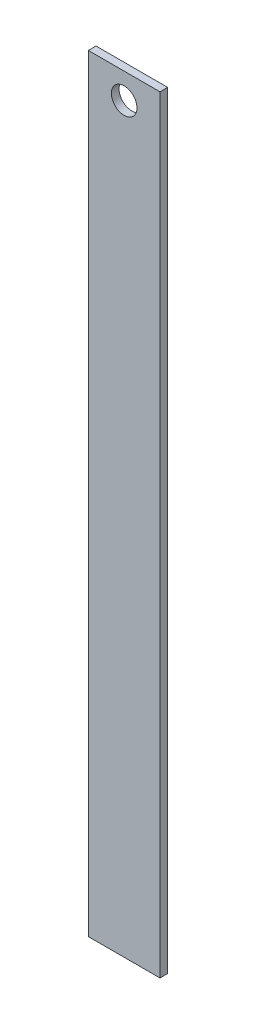
ISO-10303-21;
HEADER;
FILE_DESCRIPTION(('STEP AP214'),'2;1');
FILE_NAME('part.step','',(''),(''),'','','');
FILE_SCHEMA(('AUTOMOTIVE_DESIGN { 1 0 10303 214 1 1 1 1 }'));
ENDSEC;
DATA;
#1=APPLICATION_CONTEXT('core data for automotive mechanical design processes');
#2=APPLICATION_PROTOCOL_DEFINITION('international standard','automotive_design',2000,#1);
#3=PRODUCT_CONTEXT('',#1,'mechanical');
#4=PRODUCT('Part','Part','',(#3));
#5=PRODUCT_RELATED_PRODUCT_CATEGORY('part','',(#4));
#6=PRODUCT_DEFINITION_FORMATION('','',#4);
#7=PRODUCT_DEFINITION_CONTEXT('part definition',#1,'design');
#8=PRODUCT_DEFINITION('design','',#6,#7);
#9=PRODUCT_DEFINITION_SHAPE('','',#8);
#10=(LENGTH_UNIT() NAMED_UNIT(*) SI_UNIT(.MILLI.,.METRE.));
#11=(NAMED_UNIT(*) PLANE_ANGLE_UNIT() SI_UNIT($,.RADIAN.));
#12=(NAMED_UNIT(*) SI_UNIT($,.STERADIAN.) SOLID_ANGLE_UNIT());
#13=UNCERTAINTY_MEASURE_WITH_UNIT(LENGTH_MEASURE(1.E-05),#10,'distance_accuracy_value','');
#14=(GEOMETRIC_REPRESENTATION_CONTEXT(3) GLOBAL_UNCERTAINTY_ASSIGNED_CONTEXT((#13)) GLOBAL_UNIT_ASSIGNED_CONTEXT((#10,
#11,#12)) REPRESENTATION_CONTEXT('',''));
#15=CARTESIAN_POINT('',(0.,0.,0.));
#16=DIRECTION('',(0.,0.,1.));
#17=DIRECTION('',(1.,0.,0.));
#18=AXIS2_PLACEMENT_3D('',#15,#16,#17);
#19=CARTESIAN_POINT('',(-14.,-150.,3.));
#20=DIRECTION('',(1.,0.,0.));
#21=DIRECTION('',(0.,0.,-1.));
#22=AXIS2_PLACEMENT_3D('',#19,#20,#21);
#23=PLANE('',#22);
#24=DIRECTION('',(0.,-1.,0.));
#25=VECTOR('',#24,1.);
#26=CARTESIAN_POINT('',(-14.,-150.,0.));
#27=LINE('',#26,#25);
#28=CARTESIAN_POINT('',(-14.,150.,0.));
#29=VERTEX_POINT('',#28);
#30=CARTESIAN_POINT('',(-14.,-150.,0.));
#31=VERTEX_POINT('',#30);
#32=EDGE_CURVE('E109',#29,#31,#27,.T.);
#33=ORIENTED_EDGE('',*,*,#32,.T.);
#34=DIRECTION('',(0.,0.,-1.));
#35=VECTOR('',#34,1.);
#36=CARTESIAN_POINT('',(-14.,-150.,3.));
#37=LINE('',#36,#35);
#38=CARTESIAN_POINT('',(-14.,-150.,3.));
#39=VERTEX_POINT('',#38);
#40=EDGE_CURVE('E11',#39,#31,#37,.T.);
#41=ORIENTED_EDGE('',*,*,#40,.F.);
#42=DIRECTION('',(0.,-1.,0.));
#43=VECTOR('',#42,1.);
#44=CARTESIAN_POINT('',(-14.,-150.,3.));
#45=LINE('',#44,#43);
#46=CARTESIAN_POINT('',(-14.,150.,3.));
#47=VERTEX_POINT('',#46);
#48=EDGE_CURVE('E93',#47,#39,#45,.T.);
#49=ORIENTED_EDGE('',*,*,#48,.F.);
#50=DIRECTION('',(0.,0.,-1.));
#51=VECTOR('',#50,1.);
#52=CARTESIAN_POINT('',(-14.,150.,3.));
#53=LINE('',#52,#51);
#54=EDGE_CURVE('E105',#47,#29,#53,.T.);
#55=ORIENTED_EDGE('',*,*,#54,.T.);
#56=EDGE_LOOP('',(#33,#41,#49,#55));
#57=FACE_BOUND('',#56,.T.);
#58=ADVANCED_FACE('F41',(#57),#23,.F.);
#59=CARTESIAN_POINT('',(14.,-150.,3.));
#60=DIRECTION('',(0.,1.,0.));
#61=DIRECTION('',(0.,0.,1.));
#62=AXIS2_PLACEMENT_3D('',#59,#60,#61);
#63=PLANE('',#62);
#64=DIRECTION('',(1.,0.,0.));
#65=VECTOR('',#64,1.);
#66=CARTESIAN_POINT('',(14.,-150.,0.));
#67=LINE('',#66,#65);
#68=CARTESIAN_POINT('',(14.,-150.,0.));
#69=VERTEX_POINT('',#68);
#70=EDGE_CURVE('E98',#31,#69,#67,.T.);
#71=ORIENTED_EDGE('',*,*,#70,.T.);
#72=DIRECTION('',(0.,0.,-1.));
#73=VECTOR('',#72,1.);
#74=CARTESIAN_POINT('',(14.,-150.,3.));
#75=LINE('',#74,#73);
#76=CARTESIAN_POINT('',(14.,-150.,3.));
#77=VERTEX_POINT('',#76);
#78=EDGE_CURVE('E50',#77,#69,#75,.T.);
#79=ORIENTED_EDGE('',*,*,#78,.F.);
#80=DIRECTION('',(1.,0.,0.));
#81=VECTOR('',#80,1.);
#82=CARTESIAN_POINT('',(14.,-150.,3.));
#83=LINE('',#82,#81);
#84=EDGE_CURVE('E88',#39,#77,#83,.T.);
#85=ORIENTED_EDGE('',*,*,#84,.F.);
#86=ORIENTED_EDGE('',*,*,#40,.T.);
#87=EDGE_LOOP('',(#71,#79,#85,#86));
#88=FACE_BOUND('',#87,.T.);
#89=ADVANCED_FACE('F97',(#88),#63,.F.);
#90=CARTESIAN_POINT('',(14.,-150.,3.));
#91=DIRECTION('',(-1.,0.,0.));
#92=DIRECTION('',(0.,0.,1.));
#93=AXIS2_PLACEMENT_3D('',#90,#91,#92);
#94=PLANE('',#93);
#95=DIRECTION('',(0.,1.,0.));
#96=VECTOR('',#95,1.);
#97=CARTESIAN_POINT('',(14.,-150.,0.));
#98=LINE('',#97,#96);
#99=CARTESIAN_POINT('',(14.,150.,0.));
#100=VERTEX_POINT('',#99);
#101=EDGE_CURVE('E75',#69,#100,#98,.T.);
#102=ORIENTED_EDGE('',*,*,#101,.T.);
#103=DIRECTION('',(0.,0.,-1.));
#104=VECTOR('',#103,1.);
#105=CARTESIAN_POINT('',(14.,150.,3.));
#106=LINE('',#105,#104);
#107=CARTESIAN_POINT('',(14.,150.,3.));
#108=VERTEX_POINT('',#107);
#109=EDGE_CURVE('E100',#108,#100,#106,.T.);
#110=ORIENTED_EDGE('',*,*,#109,.F.);
#111=DIRECTION('',(0.,1.,0.));
#112=VECTOR('',#111,1.);
#113=CARTESIAN_POINT('',(14.,-150.,3.));
#114=LINE('',#113,#112);
#115=EDGE_CURVE('E91',#77,#108,#114,.T.);
#116=ORIENTED_EDGE('',*,*,#115,.F.);
#117=ORIENTED_EDGE('',*,*,#78,.T.);
#118=EDGE_LOOP('',(#102,#110,#116,#117));
#119=FACE_BOUND('',#118,.T.);
#120=ADVANCED_FACE('F101',(#119),#94,.F.);
#121=CARTESIAN_POINT('',(14.,150.,3.));
#122=DIRECTION('',(0.,-1.,0.));
#123=DIRECTION('',(0.,0.,-1.));
#124=AXIS2_PLACEMENT_3D('',#121,#122,#123);
#125=PLANE('',#124);
#126=DIRECTION('',(-1.,0.,0.));
#127=VECTOR('',#126,1.);
#128=CARTESIAN_POINT('',(14.,150.,0.));
#129=LINE('',#128,#127);
#130=EDGE_CURVE('E81',#100,#29,#129,.T.);
#131=ORIENTED_EDGE('',*,*,#130,.T.);
#132=ORIENTED_EDGE('',*,*,#54,.F.);
#133=DIRECTION('',(-1.,0.,0.));
#134=VECTOR('',#133,1.);
#135=CARTESIAN_POINT('',(14.,150.,3.));
#136=LINE('',#135,#134);
#137=EDGE_CURVE('E58',#108,#47,#136,.T.);
#138=ORIENTED_EDGE('',*,*,#137,.F.);
#139=ORIENTED_EDGE('',*,*,#109,.T.);
#140=EDGE_LOOP('',(#131,#132,#138,#139));
#141=FACE_BOUND('',#140,.T.);
#142=ADVANCED_FACE('F123',(#141),#125,.F.);
#143=CARTESIAN_POINT('',(0.,0.,3.));
#144=DIRECTION('',(0.,0.,1.));
#145=DIRECTION('',(1.,0.,0.));
#146=AXIS2_PLACEMENT_3D('',#143,#144,#145);
#147=PLANE('',#146);
#148=CARTESIAN_POINT('',(0.,140.,3.));
#149=DIRECTION('',(0.,0.,-1.));
#150=DIRECTION('',(-1.,0.,0.));
#151=AXIS2_PLACEMENT_3D('',#148,#149,#150);
#152=CIRCLE('',#151,5.);
#153=CARTESIAN_POINT('',(-5.,140.,3.));
#154=VERTEX_POINT('',#153);
#155=EDGE_CURVE('E113',#154,#154,#152,.T.);
#156=ORIENTED_EDGE('',*,*,#155,.T.);
#157=EDGE_LOOP('',(#156));
#158=FACE_BOUND('',#157,.T.);
#159=ORIENTED_EDGE('',*,*,#48,.T.);
#160=ORIENTED_EDGE('',*,*,#84,.T.);
#161=ORIENTED_EDGE('',*,*,#115,.T.);
#162=ORIENTED_EDGE('',*,*,#137,.T.);
#163=EDGE_LOOP('',(#159,#160,#161,#162));
#164=FACE_BOUND('',#163,.T.);
#165=ADVANCED_FACE('F89',(#158,#164),#147,.T.);
#166=CARTESIAN_POINT('',(0.,0.,0.));
#167=DIRECTION('',(0.,0.,1.));
#168=DIRECTION('',(1.,0.,0.));
#169=AXIS2_PLACEMENT_3D('',#166,#167,#168);
#170=PLANE('',#169);
#171=CARTESIAN_POINT('',(0.,140.,0.));
#172=DIRECTION('',(0.,0.,-1.));
#173=DIRECTION('',(-1.,0.,0.));
#174=AXIS2_PLACEMENT_3D('',#171,#172,#173);
#175=CIRCLE('',#174,5.);
#176=CARTESIAN_POINT('',(-5.,140.,0.));
#177=VERTEX_POINT('',#176);
#178=EDGE_CURVE('E130',#177,#177,#175,.T.);
#179=ORIENTED_EDGE('',*,*,#178,.F.);
#180=EDGE_LOOP('',(#179));
#181=FACE_BOUND('',#180,.T.);
#182=ORIENTED_EDGE('',*,*,#32,.F.);
#183=ORIENTED_EDGE('',*,*,#130,.F.);
#184=ORIENTED_EDGE('',*,*,#101,.F.);
#185=ORIENTED_EDGE('',*,*,#70,.F.);
#186=EDGE_LOOP('',(#182,#183,#184,#185));
#187=FACE_BOUND('',#186,.T.);
#188=ADVANCED_FACE('F126',(#181,#187),#170,.F.);
#189=CARTESIAN_POINT('',(0.,140.,3.));
#190=DIRECTION('',(0.,0.,-1.));
#191=DIRECTION('',(-1.,0.,0.));
#192=AXIS2_PLACEMENT_3D('',#189,#190,#191);
#193=CYLINDRICAL_SURFACE('',#192,5.);
#194=ORIENTED_EDGE('',*,*,#155,.F.);
#195=EDGE_LOOP('',(#194));
#196=FACE_BOUND('',#195,.T.);
#197=ORIENTED_EDGE('',*,*,#178,.T.);
#198=EDGE_LOOP('',(#197));
#199=FACE_BOUND('',#198,.T.);
#200=ADVANCED_FACE('F139',(#196,#199),#193,.F.);
#201=CLOSED_SHELL('',(#58,#89,#120,#142,#165,#188,#200));
#202=MANIFOLD_SOLID_BREP('B2',#201);
#203=ADVANCED_BREP_SHAPE_REPRESENTATION('',(#18,#202),#14);
#204=SHAPE_DEFINITION_REPRESENTATION(#9,#203);
ENDSEC;
END-ISO-10303-21;
